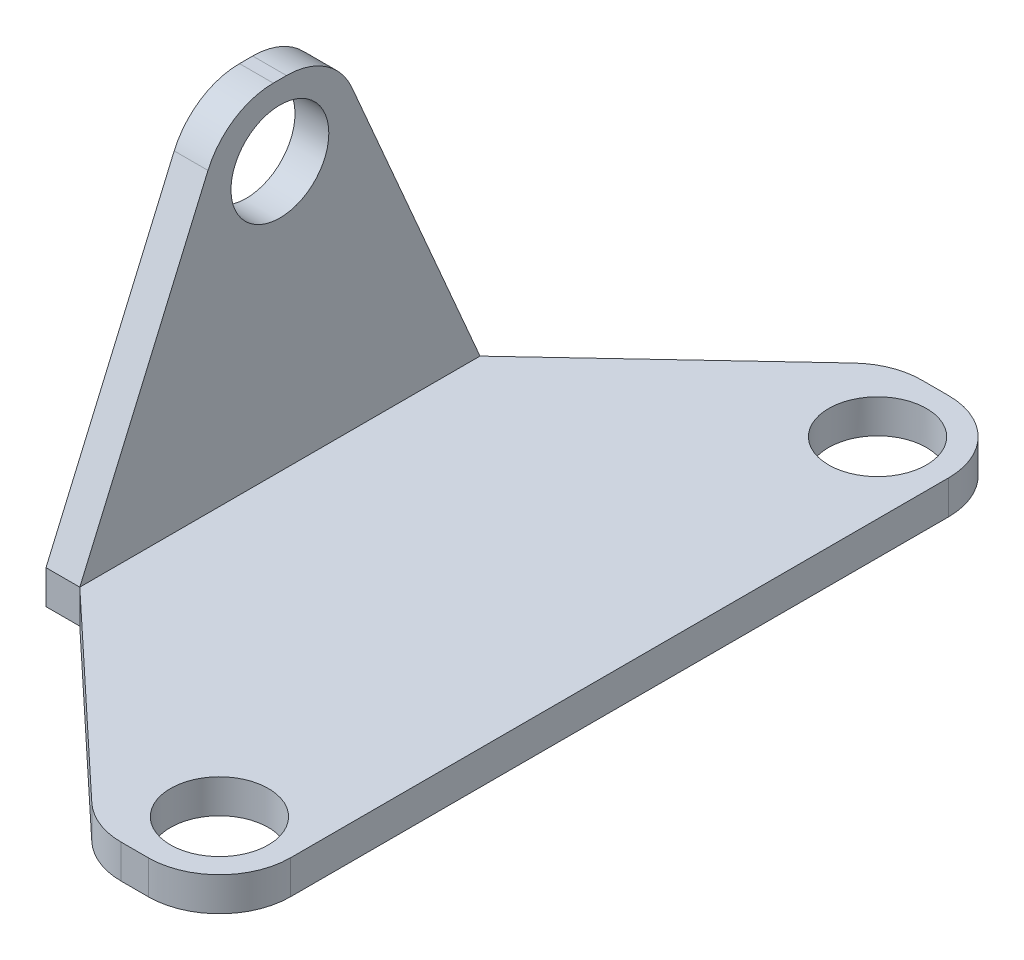
ISO-10303-21;
HEADER;
FILE_DESCRIPTION(('STEP AP214'),'2;1');
FILE_NAME('part.step','',(''),(''),'','','');
FILE_SCHEMA(('AUTOMOTIVE_DESIGN { 1 0 10303 214 1 1 1 1 }'));
ENDSEC;
DATA;
#1=APPLICATION_CONTEXT('core data for automotive mechanical design processes');
#2=APPLICATION_PROTOCOL_DEFINITION('international standard','automotive_design',2000,#1);
#3=PRODUCT_CONTEXT('',#1,'mechanical');
#4=PRODUCT('Part','Part','',(#3));
#5=PRODUCT_RELATED_PRODUCT_CATEGORY('part','',(#4));
#6=PRODUCT_DEFINITION_FORMATION('','',#4);
#7=PRODUCT_DEFINITION_CONTEXT('part definition',#1,'design');
#8=PRODUCT_DEFINITION('design','',#6,#7);
#9=PRODUCT_DEFINITION_SHAPE('','',#8);
#10=(LENGTH_UNIT() NAMED_UNIT(*) SI_UNIT(.MILLI.,.METRE.));
#11=(NAMED_UNIT(*) PLANE_ANGLE_UNIT() SI_UNIT($,.RADIAN.));
#12=(NAMED_UNIT(*) SI_UNIT($,.STERADIAN.) SOLID_ANGLE_UNIT());
#13=UNCERTAINTY_MEASURE_WITH_UNIT(LENGTH_MEASURE(1.E-05),#10,'distance_accuracy_value','');
#14=(GEOMETRIC_REPRESENTATION_CONTEXT(3) GLOBAL_UNCERTAINTY_ASSIGNED_CONTEXT((#13)) GLOBAL_UNIT_ASSIGNED_CONTEXT((#10,
#11,#12)) REPRESENTATION_CONTEXT('',''));
#15=CARTESIAN_POINT('',(0.,0.,0.));
#16=DIRECTION('',(0.,0.,1.));
#17=DIRECTION('',(1.,0.,0.));
#18=AXIS2_PLACEMENT_3D('',#15,#16,#17);
#19=CARTESIAN_POINT('',(-16.8225806451613,-14.9032258064516,22.5));
#20=DIRECTION('',(0.,-1.,0.));
#21=DIRECTION('',(0.,0.,-1.));
#22=AXIS2_PLACEMENT_3D('',#19,#20,#21);
#23=PLANE('',#22);
#24=DIRECTION('',(-0.729473692419475,0.,0.684008868413193));
#25=VECTOR('',#24,1.);
#26=CARTESIAN_POINT('',(-2.92481362971712,-14.9032258064516,-22.5));
#27=LINE('',#26,#25);
#28=CARTESIAN_POINT('',(-4.07884442434806,-14.9032258064516,-21.4178947696779));
#29=VERTEX_POINT('',#28);
#30=CARTESIAN_POINT('',(-14.9225806451613,-14.9032258064516,-11.25));
#31=VERTEX_POINT('',#30);
#32=EDGE_CURVE('E151',#29,#31,#27,.T.);
#33=ORIENTED_EDGE('',*,*,#32,.F.);
#34=CARTESIAN_POINT('',(-1.34280895069529,-14.9032258064516,-18.5));
#35=DIRECTION('',(0.,-1.,0.));
#36=DIRECTION('',(0.,0.,-1.));
#37=AXIS2_PLACEMENT_3D('',#34,#35,#36);
#38=CIRCLE('',#37,4.);
#39=CARTESIAN_POINT('',(-1.3428089506953,-14.9032258064516,-22.5));
#40=VERTEX_POINT('',#39);
#41=EDGE_CURVE('E270',#29,#40,#38,.T.);
#42=ORIENTED_EDGE('',*,*,#41,.T.);
#43=DIRECTION('',(1.,0.,0.));
#44=VECTOR('',#43,1.);
#45=CARTESIAN_POINT('',(-16.8225806451613,-14.9032258064516,-22.5));
#46=LINE('',#45,#44);
#47=CARTESIAN_POINT('',(0.177419354838698,-14.9032258064516,-22.5));
#48=VERTEX_POINT('',#47);
#49=EDGE_CURVE('E232',#40,#48,#46,.T.);
#50=ORIENTED_EDGE('',*,*,#49,.T.);
#51=CARTESIAN_POINT('',(0.177419354838705,-14.9032258064516,-18.5));
#52=DIRECTION('',(0.,-1.,0.));
#53=DIRECTION('',(0.,0.,-1.));
#54=AXIS2_PLACEMENT_3D('',#51,#52,#53);
#55=CIRCLE('',#54,4.);
#56=CARTESIAN_POINT('',(4.17741935483871,-14.9032258064516,-18.5));
#57=VERTEX_POINT('',#56);
#58=EDGE_CURVE('E268',#48,#57,#55,.T.);
#59=ORIENTED_EDGE('',*,*,#58,.T.);
#60=DIRECTION('',(0.,0.,-1.));
#61=VECTOR('',#60,1.);
#62=CARTESIAN_POINT('',(4.17741935483871,-14.9032258064516,22.5));
#63=LINE('',#62,#61);
#64=CARTESIAN_POINT('',(4.17741935483871,-14.9032258064516,18.5));
#65=VERTEX_POINT('',#64);
#66=EDGE_CURVE('E231',#65,#57,#63,.T.);
#67=ORIENTED_EDGE('',*,*,#66,.F.);
#68=CARTESIAN_POINT('',(0.177419354838705,-14.9032258064516,18.5));
#69=DIRECTION('',(0.,-1.,0.));
#70=DIRECTION('',(0.,0.,-1.));
#71=AXIS2_PLACEMENT_3D('',#68,#69,#70);
#72=CIRCLE('',#71,4.);
#73=CARTESIAN_POINT('',(0.177419354838698,-14.9032258064516,22.5));
#74=VERTEX_POINT('',#73);
#75=EDGE_CURVE('E266',#65,#74,#72,.T.);
#76=ORIENTED_EDGE('',*,*,#75,.T.);
#77=DIRECTION('',(1.,0.,0.));
#78=VECTOR('',#77,1.);
#79=CARTESIAN_POINT('',(-16.8225806451613,-14.9032258064516,22.5));
#80=LINE('',#79,#78);
#81=CARTESIAN_POINT('',(-1.3428089506953,-14.9032258064516,22.5));
#82=VERTEX_POINT('',#81);
#83=EDGE_CURVE('E223',#82,#74,#80,.T.);
#84=ORIENTED_EDGE('',*,*,#83,.F.);
#85=CARTESIAN_POINT('',(-1.34280895069529,-14.9032258064516,18.5));
#86=DIRECTION('',(0.,-1.,0.));
#87=DIRECTION('',(0.,0.,-1.));
#88=AXIS2_PLACEMENT_3D('',#85,#86,#87);
#89=CIRCLE('',#88,4.);
#90=CARTESIAN_POINT('',(-4.07884442434807,-14.9032258064516,21.4178947696779));
#91=VERTEX_POINT('',#90);
#92=EDGE_CURVE('E264',#82,#91,#89,.T.);
#93=ORIENTED_EDGE('',*,*,#92,.T.);
#94=DIRECTION('',(-0.729473692419475,0.,-0.684008868413193));
#95=VECTOR('',#94,1.);
#96=CARTESIAN_POINT('',(-2.92481362971712,-14.9032258064516,22.5));
#97=LINE('',#96,#95);
#98=CARTESIAN_POINT('',(-14.9225806451613,-14.9032258064516,11.25));
#99=VERTEX_POINT('',#98);
#100=EDGE_CURVE('E190',#91,#99,#97,.T.);
#101=ORIENTED_EDGE('',*,*,#100,.T.);
#102=DIRECTION('',(-1.,0.,0.));
#103=VECTOR('',#102,1.);
#104=CARTESIAN_POINT('',(-14.9225806451613,-14.9032258064516,11.25));
#105=LINE('',#104,#103);
#106=CARTESIAN_POINT('',(-16.8225806451613,-14.9032258064516,11.25));
#107=VERTEX_POINT('',#106);
#108=EDGE_CURVE('E192',#99,#107,#105,.T.);
#109=ORIENTED_EDGE('',*,*,#108,.T.);
#110=DIRECTION('',(0.,0.,-1.));
#111=VECTOR('',#110,1.);
#112=CARTESIAN_POINT('',(-16.8225806451613,-14.9032258064516,22.5));
#113=LINE('',#112,#111);
#114=CARTESIAN_POINT('',(-16.8225806451613,-14.9032258064516,-11.25));
#115=VERTEX_POINT('',#114);
#116=EDGE_CURVE('E178',#107,#115,#113,.T.);
#117=ORIENTED_EDGE('',*,*,#116,.T.);
#118=DIRECTION('',(-1.,0.,0.));
#119=VECTOR('',#118,1.);
#120=CARTESIAN_POINT('',(-14.9225806451613,-14.9032258064516,-11.25));
#121=LINE('',#120,#119);
#122=EDGE_CURVE('E162',#31,#115,#121,.T.);
#123=ORIENTED_EDGE('',*,*,#122,.F.);
#124=EDGE_LOOP('',(#33,#42,#50,#59,#67,#76,#84,#93,#101,#109,#117,#123));
#125=FACE_BOUND('',#124,.T.);
#126=CARTESIAN_POINT('',(0.177419354838704,-14.9032258064516,18.5));
#127=DIRECTION('',(0.,1.,0.));
#128=DIRECTION('',(0.,0.,1.));
#129=AXIS2_PLACEMENT_3D('',#126,#127,#128);
#130=CIRCLE('',#129,2.75);
#131=CARTESIAN_POINT('',(0.177419354838704,-14.9032258064516,21.25));
#132=VERTEX_POINT('',#131);
#133=EDGE_CURVE('E187',#132,#132,#130,.T.);
#134=ORIENTED_EDGE('',*,*,#133,.T.);
#135=EDGE_LOOP('',(#134));
#136=FACE_BOUND('',#135,.T.);
#137=CARTESIAN_POINT('',(0.177419354838704,-14.9032258064516,-18.5));
#138=DIRECTION('',(0.,-1.,0.));
#139=DIRECTION('',(0.,0.,-1.));
#140=AXIS2_PLACEMENT_3D('',#137,#138,#139);
#141=CIRCLE('',#140,2.75);
#142=CARTESIAN_POINT('',(0.177419354838704,-14.9032258064516,-21.25));
#143=VERTEX_POINT('',#142);
#144=EDGE_CURVE('E163',#143,#143,#141,.T.);
#145=ORIENTED_EDGE('',*,*,#144,.F.);
#146=EDGE_LOOP('',(#145));
#147=FACE_BOUND('',#146,.T.);
#148=ADVANCED_FACE('F36',(#125,#136,#147),#23,.T.);
#149=CARTESIAN_POINT('',(-16.8225806451613,-14.9032258064516,-22.5));
#150=DIRECTION('',(0.,0.,-1.));
#151=DIRECTION('',(0.,1.,0.));
#152=AXIS2_PLACEMENT_3D('',#149,#150,#151);
#153=PLANE('',#152);
#154=ORIENTED_EDGE('',*,*,#49,.F.);
#155=DIRECTION('',(0.,1.,0.));
#156=VECTOR('',#155,1.);
#157=CARTESIAN_POINT('',(-1.34280895069529,-14.9032258064516,-22.5));
#158=LINE('',#157,#156);
#159=CARTESIAN_POINT('',(-1.34280895069529,-13.0032258064516,-22.5));
#160=VERTEX_POINT('',#159);
#161=EDGE_CURVE('E252',#40,#160,#158,.T.);
#162=ORIENTED_EDGE('',*,*,#161,.T.);
#163=DIRECTION('',(1.,0.,0.));
#164=VECTOR('',#163,1.);
#165=CARTESIAN_POINT('',(-16.8225806451613,-13.0032258064516,-22.5));
#166=LINE('',#165,#164);
#167=CARTESIAN_POINT('',(0.177419354838698,-13.0032258064516,-22.5));
#168=VERTEX_POINT('',#167);
#169=EDGE_CURVE('E227',#160,#168,#166,.T.);
#170=ORIENTED_EDGE('',*,*,#169,.T.);
#171=DIRECTION('',(0.,1.,0.));
#172=VECTOR('',#171,1.);
#173=CARTESIAN_POINT('',(0.177419354838705,-14.9032258064516,-22.5));
#174=LINE('',#173,#172);
#175=EDGE_CURVE('E246',#168,#48,#174,.F.);
#176=ORIENTED_EDGE('',*,*,#175,.T.);
#177=EDGE_LOOP('',(#154,#162,#170,#176));
#178=FACE_BOUND('',#177,.T.);
#179=ADVANCED_FACE('F338',(#178),#153,.T.);
#180=CARTESIAN_POINT('',(-16.8225806451613,-13.0032258064516,-22.5));
#181=DIRECTION('',(0.,1.,0.));
#182=DIRECTION('',(0.,0.,1.));
#183=AXIS2_PLACEMENT_3D('',#180,#181,#182);
#184=PLANE('',#183);
#185=ORIENTED_EDGE('',*,*,#169,.F.);
#186=CARTESIAN_POINT('',(-1.34280895069529,-13.0032258064516,-18.5));
#187=DIRECTION('',(0.,1.,0.));
#188=DIRECTION('',(0.,0.,1.));
#189=AXIS2_PLACEMENT_3D('',#186,#187,#188);
#190=CIRCLE('',#189,4.);
#191=CARTESIAN_POINT('',(-4.07884442434806,-13.0032258064516,-21.4178947696779));
#192=VERTEX_POINT('',#191);
#193=EDGE_CURVE('E261',#160,#192,#190,.T.);
#194=ORIENTED_EDGE('',*,*,#193,.T.);
#195=DIRECTION('',(-0.729473692419475,0.,0.684008868413193));
#196=VECTOR('',#195,1.);
#197=CARTESIAN_POINT('',(-10.3202583517306,-13.0032258064516,-15.5654801834747));
#198=LINE('',#197,#196);
#199=CARTESIAN_POINT('',(-14.9225806451613,-13.0032258064516,-11.25));
#200=VERTEX_POINT('',#199);
#201=EDGE_CURVE('E183',#192,#200,#198,.T.);
#202=ORIENTED_EDGE('',*,*,#201,.T.);
#203=DIRECTION('',(0.,0.,-1.));
#204=VECTOR('',#203,1.);
#205=CARTESIAN_POINT('',(-14.9225806451613,-13.0032258064516,-22.5));
#206=LINE('',#205,#204);
#207=CARTESIAN_POINT('',(-14.9225806451613,-13.0032258064516,11.25));
#208=VERTEX_POINT('',#207);
#209=EDGE_CURVE('E219',#208,#200,#206,.T.);
#210=ORIENTED_EDGE('',*,*,#209,.F.);
#211=DIRECTION('',(-0.729473692419475,0.,-0.684008868413193));
#212=VECTOR('',#211,1.);
#213=CARTESIAN_POINT('',(-32.7737497217374,-13.0032258064516,-5.48858575958068));
#214=LINE('',#213,#212);
#215=CARTESIAN_POINT('',(-4.07884442434806,-13.0032258064516,21.4178947696779));
#216=VERTEX_POINT('',#215);
#217=EDGE_CURVE('E199',#216,#208,#214,.T.);
#218=ORIENTED_EDGE('',*,*,#217,.F.);
#219=CARTESIAN_POINT('',(-1.34280895069529,-13.0032258064516,18.5));
#220=DIRECTION('',(0.,1.,0.));
#221=DIRECTION('',(0.,0.,1.));
#222=AXIS2_PLACEMENT_3D('',#219,#220,#221);
#223=CIRCLE('',#222,4.);
#224=CARTESIAN_POINT('',(-1.3428089506953,-13.0032258064516,22.5));
#225=VERTEX_POINT('',#224);
#226=EDGE_CURVE('E255',#216,#225,#223,.T.);
#227=ORIENTED_EDGE('',*,*,#226,.T.);
#228=DIRECTION('',(1.,0.,0.));
#229=VECTOR('',#228,1.);
#230=CARTESIAN_POINT('',(-16.8225806451613,-13.0032258064516,22.5));
#231=LINE('',#230,#229);
#232=CARTESIAN_POINT('',(0.177419354838698,-13.0032258064516,22.5));
#233=VERTEX_POINT('',#232);
#234=EDGE_CURVE('E228',#225,#233,#231,.T.);
#235=ORIENTED_EDGE('',*,*,#234,.T.);
#236=CARTESIAN_POINT('',(0.177419354838705,-13.0032258064516,18.5));
#237=DIRECTION('',(0.,1.,0.));
#238=DIRECTION('',(0.,0.,1.));
#239=AXIS2_PLACEMENT_3D('',#236,#237,#238);
#240=CIRCLE('',#239,4.);
#241=CARTESIAN_POINT('',(4.17741935483871,-13.0032258064516,18.5));
#242=VERTEX_POINT('',#241);
#243=EDGE_CURVE('E257',#233,#242,#240,.T.);
#244=ORIENTED_EDGE('',*,*,#243,.T.);
#245=DIRECTION('',(0.,0.,1.));
#246=VECTOR('',#245,1.);
#247=CARTESIAN_POINT('',(4.17741935483871,-13.0032258064516,-22.5));
#248=LINE('',#247,#246);
#249=CARTESIAN_POINT('',(4.17741935483871,-13.0032258064516,-18.5));
#250=VERTEX_POINT('',#249);
#251=EDGE_CURVE('E224',#250,#242,#248,.T.);
#252=ORIENTED_EDGE('',*,*,#251,.F.);
#253=CARTESIAN_POINT('',(0.177419354838705,-13.0032258064516,-18.5));
#254=DIRECTION('',(0.,1.,0.));
#255=DIRECTION('',(0.,0.,1.));
#256=AXIS2_PLACEMENT_3D('',#253,#254,#255);
#257=CIRCLE('',#256,4.);
#258=EDGE_CURVE('E259',#250,#168,#257,.T.);
#259=ORIENTED_EDGE('',*,*,#258,.T.);
#260=EDGE_LOOP('',(#185,#194,#202,#210,#218,#227,#235,#244,#252,#259));
#261=FACE_BOUND('',#260,.T.);
#262=CARTESIAN_POINT('',(0.177419354838704,-13.0032258064516,18.5));
#263=DIRECTION('',(0.,1.,0.));
#264=DIRECTION('',(0.,0.,1.));
#265=AXIS2_PLACEMENT_3D('',#262,#263,#264);
#266=CIRCLE('',#265,2.75);
#267=CARTESIAN_POINT('',(0.177419354838704,-13.0032258064516,21.25));
#268=VERTEX_POINT('',#267);
#269=EDGE_CURVE('E201',#268,#268,#266,.T.);
#270=ORIENTED_EDGE('',*,*,#269,.F.);
#271=EDGE_LOOP('',(#270));
#272=FACE_BOUND('',#271,.T.);
#273=CARTESIAN_POINT('',(0.177419354838704,-13.0032258064516,-18.5));
#274=DIRECTION('',(0.,1.,0.));
#275=DIRECTION('',(0.,0.,1.));
#276=AXIS2_PLACEMENT_3D('',#273,#274,#275);
#277=CIRCLE('',#276,2.75);
#278=CARTESIAN_POINT('',(0.177419354838704,-13.0032258064516,-15.75));
#279=VERTEX_POINT('',#278);
#280=EDGE_CURVE('E186',#279,#279,#277,.F.);
#281=ORIENTED_EDGE('',*,*,#280,.T.);
#282=EDGE_LOOP('',(#281));
#283=FACE_BOUND('',#282,.T.);
#284=ADVANCED_FACE('F329',(#261,#272,#283),#184,.T.);
#285=CARTESIAN_POINT('',(-16.8225806451613,6.09677419354839,22.5));
#286=DIRECTION('',(-1.,0.,0.));
#287=DIRECTION('',(0.,0.,1.));
#288=AXIS2_PLACEMENT_3D('',#285,#286,#287);
#289=PLANE('',#288);
#290=CARTESIAN_POINT('',(-16.8225806451613,2.09677419354839,0.));
#291=DIRECTION('',(1.,0.,0.));
#292=DIRECTION('',(0.,0.,-1.));
#293=AXIS2_PLACEMENT_3D('',#290,#291,#292);
#294=CIRCLE('',#293,2.75);
#295=CARTESIAN_POINT('',(-16.8225806451613,2.09677419354839,-2.75));
#296=VERTEX_POINT('',#295);
#297=EDGE_CURVE('E209',#296,#296,#294,.T.);
#298=ORIENTED_EDGE('',*,*,#297,.T.);
#299=EDGE_LOOP('',(#298));
#300=FACE_BOUND('',#299,.T.);
#301=DIRECTION('',(0.,0.,-1.));
#302=VECTOR('',#301,1.);
#303=CARTESIAN_POINT('',(-16.8225806451613,6.09677419354839,22.5));
#304=LINE('',#303,#302);
#305=CARTESIAN_POINT('',(-16.8225806451613,6.09677419354839,0.370557446777518));
#306=VERTEX_POINT('',#305);
#307=CARTESIAN_POINT('',(-16.8225806451613,6.09677419354839,-0.370557446777515));
#308=VERTEX_POINT('',#307);
#309=EDGE_CURVE('E217',#306,#308,#304,.T.);
#310=ORIENTED_EDGE('',*,*,#309,.T.);
#311=CARTESIAN_POINT('',(-16.8225806451613,2.09677419354839,-0.370557446777522));
#312=DIRECTION('',(-1.,0.,0.));
#313=DIRECTION('',(0.,0.,1.));
#314=AXIS2_PLACEMENT_3D('',#311,#312,#313);
#315=CIRCLE('',#314,4.);
#316=CARTESIAN_POINT('',(-16.8225806451613,3.68288652529511,-4.04264781482145));
#317=VERTEX_POINT('',#316);
#318=EDGE_CURVE('E44',#308,#317,#315,.T.);
#319=ORIENTED_EDGE('',*,*,#318,.T.);
#320=DIRECTION('',(0.,-0.918022592010982,-0.39652808293668));
#321=VECTOR('',#320,1.);
#322=CARTESIAN_POINT('',(-16.8225806451613,-13.0032258064516,-11.25));
#323=LINE('',#322,#321);
#324=CARTESIAN_POINT('',(-16.8225806451613,-13.0032258064516,-11.25));
#325=VERTEX_POINT('',#324);
#326=EDGE_CURVE('E202',#317,#325,#323,.T.);
#327=ORIENTED_EDGE('',*,*,#326,.T.);
#328=DIRECTION('',(0.,-1.,0.));
#329=VECTOR('',#328,1.);
#330=CARTESIAN_POINT('',(-16.8225806451613,6.09677419354839,-11.25));
#331=LINE('',#330,#329);
#332=EDGE_CURVE('E172',#325,#115,#331,.T.);
#333=ORIENTED_EDGE('',*,*,#332,.T.);
#334=ORIENTED_EDGE('',*,*,#116,.F.);
#335=DIRECTION('',(0.,-1.,0.));
#336=VECTOR('',#335,1.);
#337=CARTESIAN_POINT('',(-16.8225806451613,6.09677419354839,11.25));
#338=LINE('',#337,#336);
#339=CARTESIAN_POINT('',(-16.8225806451613,-13.0032258064516,11.25));
#340=VERTEX_POINT('',#339);
#341=EDGE_CURVE('E197',#340,#107,#338,.T.);
#342=ORIENTED_EDGE('',*,*,#341,.F.);
#343=DIRECTION('',(0.,0.918022592010982,-0.396528082936681));
#344=VECTOR('',#343,1.);
#345=CARTESIAN_POINT('',(-16.8225806451613,6.09677419354839,3.));
#346=LINE('',#345,#344);
#347=CARTESIAN_POINT('',(-16.8225806451613,3.68288652529511,4.04264781482144));
#348=VERTEX_POINT('',#347);
#349=EDGE_CURVE('E204',#340,#348,#346,.T.);
#350=ORIENTED_EDGE('',*,*,#349,.T.);
#351=CARTESIAN_POINT('',(-16.8225806451613,2.09677419354839,0.370557446777512));
#352=DIRECTION('',(-1.,0.,0.));
#353=DIRECTION('',(0.,0.,1.));
#354=AXIS2_PLACEMENT_3D('',#351,#352,#353);
#355=CIRCLE('',#354,4.);
#356=EDGE_CURVE('E296',#348,#306,#355,.T.);
#357=ORIENTED_EDGE('',*,*,#356,.T.);
#358=EDGE_LOOP('',(#310,#319,#327,#333,#334,#342,#350,#357));
#359=FACE_BOUND('',#358,.T.);
#360=ADVANCED_FACE('F300',(#300,#359),#289,.T.);
#361=CARTESIAN_POINT('',(4.17741935483871,0.,0.));
#362=DIRECTION('',(1.,0.,0.));
#363=DIRECTION('',(0.,0.,-1.));
#364=AXIS2_PLACEMENT_3D('',#361,#362,#363);
#365=PLANE('',#364);
#366=ORIENTED_EDGE('',*,*,#66,.T.);
#367=DIRECTION('',(0.,1.,0.));
#368=VECTOR('',#367,1.);
#369=CARTESIAN_POINT('',(4.17741935483871,0.,-18.5));
#370=LINE('',#369,#368);
#371=EDGE_CURVE('E275',#57,#250,#370,.T.);
#372=ORIENTED_EDGE('',*,*,#371,.T.);
#373=ORIENTED_EDGE('',*,*,#251,.T.);
#374=DIRECTION('',(0.,-1.,0.));
#375=VECTOR('',#374,1.);
#376=CARTESIAN_POINT('',(4.17741935483871,0.,18.5));
#377=LINE('',#376,#375);
#378=EDGE_CURVE('E272',#242,#65,#377,.T.);
#379=ORIENTED_EDGE('',*,*,#378,.T.);
#380=EDGE_LOOP('',(#366,#372,#373,#379));
#381=FACE_BOUND('',#380,.T.);
#382=ADVANCED_FACE('F345',(#381),#365,.T.);
#383=CARTESIAN_POINT('',(-1.91935483870969,6.09677419354839,0.));
#384=DIRECTION('',(0.,-1.,0.));
#385=DIRECTION('',(0.,0.,-1.));
#386=AXIS2_PLACEMENT_3D('',#383,#384,#385);
#387=PLANE('',#386);
#388=DIRECTION('',(0.,0.,1.));
#389=VECTOR('',#388,1.);
#390=CARTESIAN_POINT('',(-14.9225806451613,6.09677419354839,-22.5));
#391=LINE('',#390,#389);
#392=CARTESIAN_POINT('',(-14.9225806451613,6.09677419354839,-0.370557446777529));
#393=VERTEX_POINT('',#392);
#394=CARTESIAN_POINT('',(-14.9225806451613,6.09677419354839,0.370557446777504));
#395=VERTEX_POINT('',#394);
#396=EDGE_CURVE('E214',#393,#395,#391,.T.);
#397=ORIENTED_EDGE('',*,*,#396,.F.);
#398=DIRECTION('',(1.,0.,0.));
#399=VECTOR('',#398,1.);
#400=CARTESIAN_POINT('',(-1.91935483870969,6.09677419354839,-0.370557446777521));
#401=LINE('',#400,#399);
#402=EDGE_CURVE('E57',#393,#308,#401,.F.);
#403=ORIENTED_EDGE('',*,*,#402,.T.);
#404=ORIENTED_EDGE('',*,*,#309,.F.);
#405=DIRECTION('',(1.,0.,0.));
#406=VECTOR('',#405,1.);
#407=CARTESIAN_POINT('',(-1.91935483870969,6.09677419354839,0.370557446777512));
#408=LINE('',#407,#406);
#409=EDGE_CURVE('E292',#306,#395,#408,.T.);
#410=ORIENTED_EDGE('',*,*,#409,.T.);
#411=EDGE_LOOP('',(#397,#403,#404,#410));
#412=FACE_BOUND('',#411,.T.);
#413=ADVANCED_FACE('F310',(#412),#387,.F.);
#414=CARTESIAN_POINT('',(-16.8225806451613,-13.0032258064516,22.5));
#415=DIRECTION('',(0.,0.,1.));
#416=DIRECTION('',(1.,0.,0.));
#417=AXIS2_PLACEMENT_3D('',#414,#415,#416);
#418=PLANE('',#417);
#419=ORIENTED_EDGE('',*,*,#83,.T.);
#420=DIRECTION('',(0.,-1.,0.));
#421=VECTOR('',#420,1.);
#422=CARTESIAN_POINT('',(0.177419354838705,-13.0032258064516,22.5));
#423=LINE('',#422,#421);
#424=EDGE_CURVE('E280',#74,#233,#423,.F.);
#425=ORIENTED_EDGE('',*,*,#424,.T.);
#426=ORIENTED_EDGE('',*,*,#234,.F.);
#427=DIRECTION('',(0.,1.,0.));
#428=VECTOR('',#427,1.);
#429=CARTESIAN_POINT('',(-1.34280895069529,-14.9032258064516,22.5));
#430=LINE('',#429,#428);
#431=EDGE_CURVE('E278',#225,#82,#430,.F.);
#432=ORIENTED_EDGE('',*,*,#431,.T.);
#433=EDGE_LOOP('',(#419,#425,#426,#432));
#434=FACE_BOUND('',#433,.T.);
#435=ADVANCED_FACE('F355',(#434),#418,.T.);
#436=CARTESIAN_POINT('',(-14.9225806451613,6.09677419354839,-22.5));
#437=DIRECTION('',(1.,0.,0.));
#438=DIRECTION('',(0.,0.,-1.));
#439=AXIS2_PLACEMENT_3D('',#436,#437,#438);
#440=PLANE('',#439);
#441=DIRECTION('',(0.,-0.918022592010982,-0.39652808293668));
#442=VECTOR('',#441,1.);
#443=CARTESIAN_POINT('',(-14.9225806451613,-1.00164970725381,-6.06607315087006));
#444=LINE('',#443,#442);
#445=CARTESIAN_POINT('',(-14.9225806451613,3.68288652529511,-4.04264781482145));
#446=VERTEX_POINT('',#445);
#447=EDGE_CURVE('E221',#446,#200,#444,.T.);
#448=ORIENTED_EDGE('',*,*,#447,.F.);
#449=CARTESIAN_POINT('',(-14.9225806451613,2.09677419354839,-0.370557446777522));
#450=DIRECTION('',(1.,0.,0.));
#451=DIRECTION('',(0.,0.,-1.));
#452=AXIS2_PLACEMENT_3D('',#449,#450,#451);
#453=CIRCLE('',#452,4.);
#454=EDGE_CURVE('E290',#446,#393,#453,.T.);
#455=ORIENTED_EDGE('',*,*,#454,.T.);
#456=ORIENTED_EDGE('',*,*,#396,.T.);
#457=CARTESIAN_POINT('',(-14.9225806451613,2.09677419354839,0.370557446777512));
#458=DIRECTION('',(1.,0.,0.));
#459=DIRECTION('',(0.,0.,-1.));
#460=AXIS2_PLACEMENT_3D('',#457,#458,#459);
#461=CIRCLE('',#460,4.);
#462=CARTESIAN_POINT('',(-14.9225806451613,3.68288652529511,4.04264781482144));
#463=VERTEX_POINT('',#462);
#464=EDGE_CURVE('E288',#395,#463,#461,.T.);
#465=ORIENTED_EDGE('',*,*,#464,.T.);
#466=DIRECTION('',(0.,0.918022592010982,-0.396528082936681));
#467=VECTOR('',#466,1.);
#468=CARTESIAN_POINT('',(-14.9225806451613,15.3793285253667,-1.0094802742147));
#469=LINE('',#468,#467);
#470=EDGE_CURVE('E244',#208,#463,#469,.T.);
#471=ORIENTED_EDGE('',*,*,#470,.F.);
#472=ORIENTED_EDGE('',*,*,#209,.T.);
#473=EDGE_LOOP('',(#448,#455,#456,#465,#471,#472));
#474=FACE_BOUND('',#473,.T.);
#475=CARTESIAN_POINT('',(-14.9225806451613,2.09677419354839,0.));
#476=DIRECTION('',(1.,0.,0.));
#477=DIRECTION('',(0.,0.,-1.));
#478=AXIS2_PLACEMENT_3D('',#475,#476,#477);
#479=CIRCLE('',#478,2.75);
#480=CARTESIAN_POINT('',(-14.9225806451613,2.09677419354839,-2.75));
#481=VERTEX_POINT('',#480);
#482=EDGE_CURVE('E213',#481,#481,#479,.T.);
#483=ORIENTED_EDGE('',*,*,#482,.F.);
#484=EDGE_LOOP('',(#483));
#485=FACE_BOUND('',#484,.T.);
#486=ADVANCED_FACE('F308',(#474,#485),#440,.T.);
#487=CARTESIAN_POINT('',(-16.8225806451613,6.09677419354839,3.));
#488=DIRECTION('',(0.,-0.396528082936681,-0.918022592010981));
#489=DIRECTION('',(0.,0.918022592010982,-0.396528082936681));
#490=AXIS2_PLACEMENT_3D('',#487,#488,#489);
#491=PLANE('',#490);
#492=ORIENTED_EDGE('',*,*,#470,.T.);
#493=DIRECTION('',(1.,0.,0.));
#494=VECTOR('',#493,1.);
#495=CARTESIAN_POINT('',(-16.8225806451613,3.68288652529511,4.04264781482144));
#496=LINE('',#495,#494);
#497=EDGE_CURVE('E11',#463,#348,#496,.F.);
#498=ORIENTED_EDGE('',*,*,#497,.T.);
#499=ORIENTED_EDGE('',*,*,#349,.F.);
#500=DIRECTION('',(1.,0.,0.));
#501=VECTOR('',#500,1.);
#502=CARTESIAN_POINT('',(-16.8225806451613,-13.0032258064516,11.25));
#503=LINE('',#502,#501);
#504=EDGE_CURVE('E206',#340,#208,#503,.T.);
#505=ORIENTED_EDGE('',*,*,#504,.T.);
#506=EDGE_LOOP('',(#492,#498,#499,#505));
#507=FACE_BOUND('',#506,.T.);
#508=ADVANCED_FACE('F316',(#507),#491,.F.);
#509=CARTESIAN_POINT('',(-16.8225806451613,2.09677419354839,0.));
#510=DIRECTION('',(1.,0.,0.));
#511=DIRECTION('',(0.,0.,-1.));
#512=AXIS2_PLACEMENT_3D('',#509,#510,#511);
#513=CYLINDRICAL_SURFACE('',#512,2.75);
#514=ORIENTED_EDGE('',*,*,#482,.T.);
#515=EDGE_LOOP('',(#514));
#516=FACE_BOUND('',#515,.T.);
#517=ORIENTED_EDGE('',*,*,#297,.F.);
#518=EDGE_LOOP('',(#517));
#519=FACE_BOUND('',#518,.T.);
#520=ADVANCED_FACE('F505',(#516,#519),#513,.F.);
#521=CARTESIAN_POINT('',(-16.8225806451613,-13.0032258064516,-11.25));
#522=DIRECTION('',(0.,-0.39652808293668,0.918022592010982));
#523=DIRECTION('',(0.,-0.918022592010982,-0.39652808293668));
#524=AXIS2_PLACEMENT_3D('',#521,#522,#523);
#525=PLANE('',#524);
#526=ORIENTED_EDGE('',*,*,#326,.F.);
#527=DIRECTION('',(1.,0.,0.));
#528=VECTOR('',#527,1.);
#529=CARTESIAN_POINT('',(-16.8225806451613,3.68288652529511,-4.04264781482145));
#530=LINE('',#529,#528);
#531=EDGE_CURVE('E285',#317,#446,#530,.T.);
#532=ORIENTED_EDGE('',*,*,#531,.T.);
#533=ORIENTED_EDGE('',*,*,#447,.T.);
#534=DIRECTION('',(1.,0.,0.));
#535=VECTOR('',#534,1.);
#536=CARTESIAN_POINT('',(-16.8225806451613,-13.0032258064516,-11.25));
#537=LINE('',#536,#535);
#538=EDGE_CURVE('E171',#325,#200,#537,.T.);
#539=ORIENTED_EDGE('',*,*,#538,.F.);
#540=EDGE_LOOP('',(#526,#532,#533,#539));
#541=FACE_BOUND('',#540,.T.);
#542=ADVANCED_FACE('F304',(#541),#525,.F.);
#543=CARTESIAN_POINT('',(-2.92481362971712,-14.9032258064516,22.5));
#544=DIRECTION('',(0.684008868413193,0.,-0.729473692419475));
#545=DIRECTION('',(-0.729473692419475,0.,-0.684008868413193));
#546=AXIS2_PLACEMENT_3D('',#543,#544,#545);
#547=PLANE('',#546);
#548=ORIENTED_EDGE('',*,*,#100,.F.);
#549=DIRECTION('',(0.,1.,0.));
#550=VECTOR('',#549,1.);
#551=CARTESIAN_POINT('',(-4.07884442434807,-13.0032258064516,21.4178947696779));
#552=LINE('',#551,#550);
#553=EDGE_CURVE('E282',#91,#216,#552,.T.);
#554=ORIENTED_EDGE('',*,*,#553,.T.);
#555=ORIENTED_EDGE('',*,*,#217,.T.);
#556=DIRECTION('',(0.,1.,0.));
#557=VECTOR('',#556,1.);
#558=CARTESIAN_POINT('',(-14.9225806451613,-14.9032258064516,11.25));
#559=LINE('',#558,#557);
#560=EDGE_CURVE('E194',#99,#208,#559,.T.);
#561=ORIENTED_EDGE('',*,*,#560,.F.);
#562=EDGE_LOOP('',(#548,#554,#555,#561));
#563=FACE_BOUND('',#562,.T.);
#564=ADVANCED_FACE('F324',(#563),#547,.F.);
#565=CARTESIAN_POINT('',(-14.9225806451613,-14.9032258064516,11.25));
#566=DIRECTION('',(0.,0.,-1.));
#567=DIRECTION('',(-1.,0.,0.));
#568=AXIS2_PLACEMENT_3D('',#565,#566,#567);
#569=PLANE('',#568);
#570=ORIENTED_EDGE('',*,*,#341,.T.);
#571=ORIENTED_EDGE('',*,*,#108,.F.);
#572=ORIENTED_EDGE('',*,*,#560,.T.);
#573=ORIENTED_EDGE('',*,*,#504,.F.);
#574=EDGE_LOOP('',(#570,#571,#572,#573));
#575=FACE_BOUND('',#574,.T.);
#576=ADVANCED_FACE('F319',(#575),#569,.F.);
#577=CARTESIAN_POINT('',(0.177419354838704,-14.9032258064516,18.5));
#578=DIRECTION('',(0.,1.,0.));
#579=DIRECTION('',(0.,0.,1.));
#580=AXIS2_PLACEMENT_3D('',#577,#578,#579);
#581=CYLINDRICAL_SURFACE('',#580,2.75);
#582=ORIENTED_EDGE('',*,*,#269,.T.);
#583=EDGE_LOOP('',(#582));
#584=FACE_BOUND('',#583,.T.);
#585=ORIENTED_EDGE('',*,*,#133,.F.);
#586=EDGE_LOOP('',(#585));
#587=FACE_BOUND('',#586,.T.);
#588=ADVANCED_FACE('F444',(#584,#587),#581,.F.);
#589=CARTESIAN_POINT('',(-2.92481362971712,-14.9032258064516,-22.5));
#590=DIRECTION('',(-0.684008868413193,0.,-0.729473692419475));
#591=DIRECTION('',(-0.729473692419475,0.,0.684008868413193));
#592=AXIS2_PLACEMENT_3D('',#589,#590,#591);
#593=PLANE('',#592);
#594=ORIENTED_EDGE('',*,*,#201,.F.);
#595=DIRECTION('',(0.,1.,0.));
#596=VECTOR('',#595,1.);
#597=CARTESIAN_POINT('',(-4.07884442434807,-14.9032258064516,-21.4178947696779));
#598=LINE('',#597,#596);
#599=EDGE_CURVE('E158',#192,#29,#598,.F.);
#600=ORIENTED_EDGE('',*,*,#599,.T.);
#601=ORIENTED_EDGE('',*,*,#32,.T.);
#602=DIRECTION('',(0.,1.,0.));
#603=VECTOR('',#602,1.);
#604=CARTESIAN_POINT('',(-14.9225806451613,-14.9032258064516,-11.25));
#605=LINE('',#604,#603);
#606=EDGE_CURVE('E155',#31,#200,#605,.T.);
#607=ORIENTED_EDGE('',*,*,#606,.T.);
#608=EDGE_LOOP('',(#594,#600,#601,#607));
#609=FACE_BOUND('',#608,.T.);
#610=ADVANCED_FACE('F154',(#609),#593,.T.);
#611=CARTESIAN_POINT('',(-14.9225806451613,-14.9032258064516,-11.25));
#612=DIRECTION('',(0.,0.,-1.));
#613=DIRECTION('',(-1.,0.,0.));
#614=AXIS2_PLACEMENT_3D('',#611,#612,#613);
#615=PLANE('',#614);
#616=ORIENTED_EDGE('',*,*,#538,.T.);
#617=ORIENTED_EDGE('',*,*,#606,.F.);
#618=ORIENTED_EDGE('',*,*,#122,.T.);
#619=ORIENTED_EDGE('',*,*,#332,.F.);
#620=EDGE_LOOP('',(#616,#617,#618,#619));
#621=FACE_BOUND('',#620,.T.);
#622=ADVANCED_FACE('F167',(#621),#615,.T.);
#623=CARTESIAN_POINT('',(0.177419354838704,-14.9032258064516,-18.5));
#624=DIRECTION('',(0.,1.,0.));
#625=DIRECTION('',(0.,0.,1.));
#626=AXIS2_PLACEMENT_3D('',#623,#624,#625);
#627=CYLINDRICAL_SURFACE('',#626,2.75);
#628=ORIENTED_EDGE('',*,*,#280,.F.);
#629=EDGE_LOOP('',(#628));
#630=FACE_BOUND('',#629,.T.);
#631=ORIENTED_EDGE('',*,*,#144,.T.);
#632=EDGE_LOOP('',(#631));
#633=FACE_BOUND('',#632,.T.);
#634=ADVANCED_FACE('F385',(#630,#633),#627,.F.);
#635=CARTESIAN_POINT('',(-1.34280895069529,-14.9032258064516,-18.5));
#636=DIRECTION('',(0.,1.,0.));
#637=DIRECTION('',(-1.,0.,0.));
#638=AXIS2_PLACEMENT_3D('',#635,#636,#637);
#639=CYLINDRICAL_SURFACE('',#638,4.);
#640=ORIENTED_EDGE('',*,*,#41,.F.);
#641=ORIENTED_EDGE('',*,*,#599,.F.);
#642=ORIENTED_EDGE('',*,*,#193,.F.);
#643=ORIENTED_EDGE('',*,*,#161,.F.);
#644=EDGE_LOOP('',(#640,#641,#642,#643));
#645=FACE_BOUND('',#644,.T.);
#646=ADVANCED_FACE('F333',(#645),#639,.T.);
#647=CARTESIAN_POINT('',(0.177419354838705,0.,-18.5));
#648=DIRECTION('',(0.,1.,0.));
#649=DIRECTION('',(0.,0.,1.));
#650=AXIS2_PLACEMENT_3D('',#647,#648,#649);
#651=CYLINDRICAL_SURFACE('',#650,4.);
#652=ORIENTED_EDGE('',*,*,#58,.F.);
#653=ORIENTED_EDGE('',*,*,#175,.F.);
#654=ORIENTED_EDGE('',*,*,#258,.F.);
#655=ORIENTED_EDGE('',*,*,#371,.F.);
#656=EDGE_LOOP('',(#652,#653,#654,#655));
#657=FACE_BOUND('',#656,.T.);
#658=ADVANCED_FACE('F341',(#657),#651,.T.);
#659=CARTESIAN_POINT('',(0.177419354838705,0.,18.5));
#660=DIRECTION('',(0.,-1.,0.));
#661=DIRECTION('',(0.,0.,-1.));
#662=AXIS2_PLACEMENT_3D('',#659,#660,#661);
#663=CYLINDRICAL_SURFACE('',#662,4.);
#664=ORIENTED_EDGE('',*,*,#243,.F.);
#665=ORIENTED_EDGE('',*,*,#424,.F.);
#666=ORIENTED_EDGE('',*,*,#75,.F.);
#667=ORIENTED_EDGE('',*,*,#378,.F.);
#668=EDGE_LOOP('',(#664,#665,#666,#667));
#669=FACE_BOUND('',#668,.T.);
#670=ADVANCED_FACE('F350',(#669),#663,.T.);
#671=CARTESIAN_POINT('',(-1.34280895069529,-14.9032258064516,18.5));
#672=DIRECTION('',(0.,-1.,0.));
#673=DIRECTION('',(0.,0.,-1.));
#674=AXIS2_PLACEMENT_3D('',#671,#672,#673);
#675=CYLINDRICAL_SURFACE('',#674,4.);
#676=ORIENTED_EDGE('',*,*,#92,.F.);
#677=ORIENTED_EDGE('',*,*,#431,.F.);
#678=ORIENTED_EDGE('',*,*,#226,.F.);
#679=ORIENTED_EDGE('',*,*,#553,.F.);
#680=EDGE_LOOP('',(#676,#677,#678,#679));
#681=FACE_BOUND('',#680,.T.);
#682=ADVANCED_FACE('F358',(#681),#675,.T.);
#683=CARTESIAN_POINT('',(-16.8225806451613,2.09677419354839,-0.370557446777522));
#684=DIRECTION('',(1.,0.,0.));
#685=DIRECTION('',(0.,1.,0.));
#686=AXIS2_PLACEMENT_3D('',#683,#684,#685);
#687=CYLINDRICAL_SURFACE('',#686,4.);
#688=ORIENTED_EDGE('',*,*,#318,.F.);
#689=ORIENTED_EDGE('',*,*,#402,.F.);
#690=ORIENTED_EDGE('',*,*,#454,.F.);
#691=ORIENTED_EDGE('',*,*,#531,.F.);
#692=EDGE_LOOP('',(#688,#689,#690,#691));
#693=FACE_BOUND('',#692,.T.);
#694=ADVANCED_FACE('F306',(#693),#687,.T.);
#695=CARTESIAN_POINT('',(-1.91935483870969,2.09677419354839,0.370557446777512));
#696=DIRECTION('',(1.,0.,0.));
#697=DIRECTION('',(0.,1.,0.));
#698=AXIS2_PLACEMENT_3D('',#695,#696,#697);
#699=CYLINDRICAL_SURFACE('',#698,4.);
#700=ORIENTED_EDGE('',*,*,#356,.F.);
#701=ORIENTED_EDGE('',*,*,#497,.F.);
#702=ORIENTED_EDGE('',*,*,#464,.F.);
#703=ORIENTED_EDGE('',*,*,#409,.F.);
#704=EDGE_LOOP('',(#700,#701,#702,#703));
#705=FACE_BOUND('',#704,.T.);
#706=ADVANCED_FACE('F38',(#705),#699,.T.);
#707=CLOSED_SHELL('',(#148,#179,#284,#360,#382,#413,#435,#486,#508,#520,#542,#564,#576,#588,
#610,#622,#634,#646,#658,#670,#682,#694,#706));
#708=MANIFOLD_SOLID_BREP('B2',#707);
#709=ADVANCED_BREP_SHAPE_REPRESENTATION('',(#18,#708),#14);
#710=SHAPE_DEFINITION_REPRESENTATION(#9,#709);
ENDSEC;
END-ISO-10303-21;
